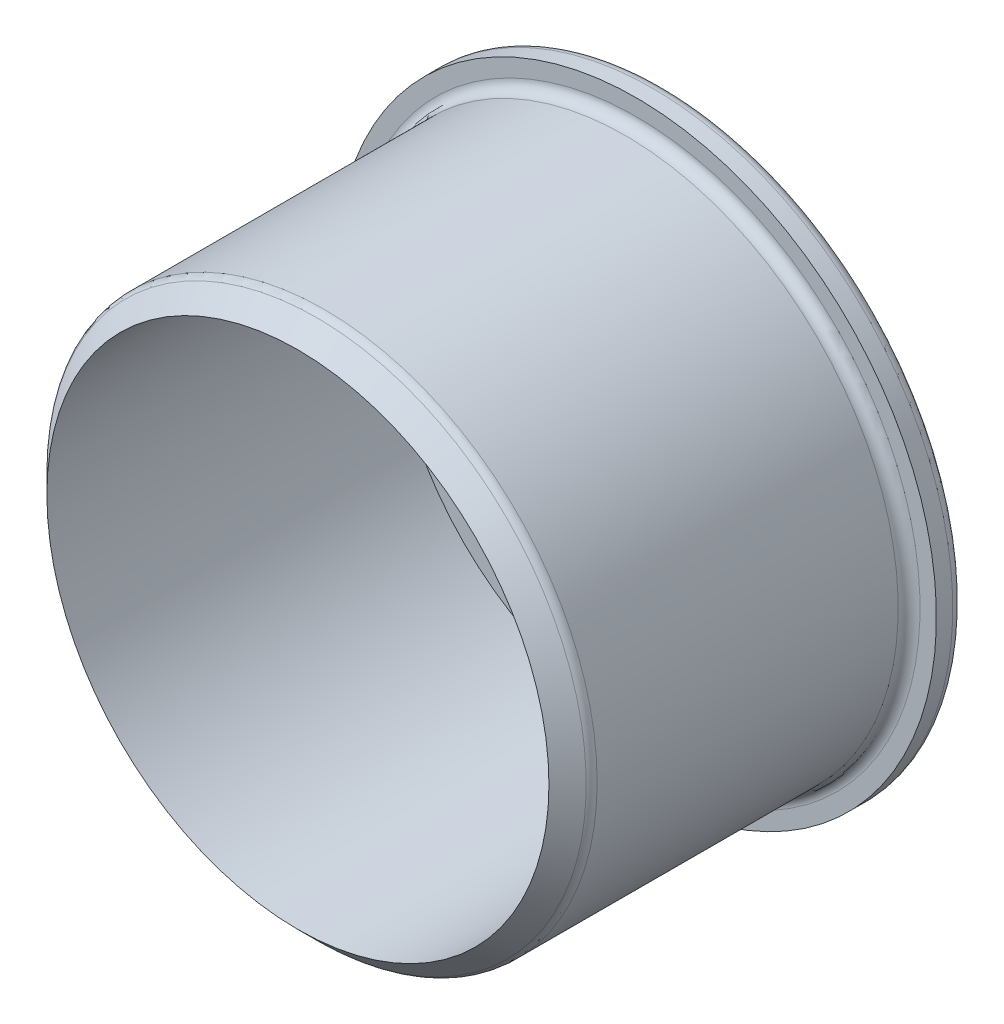
ISO-10303-21;
HEADER;
FILE_DESCRIPTION(('STEP AP214'),'2;1');
FILE_NAME('part.step','',(''),(''),'','','');
FILE_SCHEMA(('AUTOMOTIVE_DESIGN { 1 0 10303 214 1 1 1 1 }'));
ENDSEC;
DATA;
#1=APPLICATION_CONTEXT('core data for automotive mechanical design processes');
#2=APPLICATION_PROTOCOL_DEFINITION('international standard','automotive_design',2000,#1);
#3=PRODUCT_CONTEXT('',#1,'mechanical');
#4=PRODUCT('Part','Part','',(#3));
#5=PRODUCT_RELATED_PRODUCT_CATEGORY('part','',(#4));
#6=PRODUCT_DEFINITION_FORMATION('','',#4);
#7=PRODUCT_DEFINITION_CONTEXT('part definition',#1,'design');
#8=PRODUCT_DEFINITION('design','',#6,#7);
#9=PRODUCT_DEFINITION_SHAPE('','',#8);
#10=(LENGTH_UNIT() NAMED_UNIT(*) SI_UNIT(.MILLI.,.METRE.));
#11=(NAMED_UNIT(*) PLANE_ANGLE_UNIT() SI_UNIT($,.RADIAN.));
#12=(NAMED_UNIT(*) SI_UNIT($,.STERADIAN.) SOLID_ANGLE_UNIT());
#13=UNCERTAINTY_MEASURE_WITH_UNIT(LENGTH_MEASURE(1.E-05),#10,'distance_accuracy_value','');
#14=(GEOMETRIC_REPRESENTATION_CONTEXT(3) GLOBAL_UNCERTAINTY_ASSIGNED_CONTEXT((#13)) GLOBAL_UNIT_ASSIGNED_CONTEXT((#10,
#11,#12)) REPRESENTATION_CONTEXT('',''));
#15=CARTESIAN_POINT('',(0.,0.,0.));
#16=DIRECTION('',(0.,0.,1.));
#17=DIRECTION('',(1.,0.,0.));
#18=AXIS2_PLACEMENT_3D('',#15,#16,#17);
#19=CARTESIAN_POINT('',(0.,0.,32.));
#20=DIRECTION('',(0.,0.,-1.));
#21=DIRECTION('',(-1.,0.,0.));
#22=AXIS2_PLACEMENT_3D('',#19,#20,#21);
#23=CYLINDRICAL_SURFACE('',#22,25.);
#24=CARTESIAN_POINT('',(0.,0.,1.));
#25=DIRECTION('',(0.,0.,-1.));
#26=DIRECTION('',(-1.,0.,0.));
#27=AXIS2_PLACEMENT_3D('',#24,#25,#26);
#28=CIRCLE('',#27,25.);
#29=CARTESIAN_POINT('',(-25.,0.,1.));
#30=VERTEX_POINT('',#29);
#31=EDGE_CURVE('E59',#30,#30,#28,.F.);
#32=ORIENTED_EDGE('',*,*,#31,.T.);
#33=EDGE_LOOP('',(#32));
#34=FACE_BOUND('',#33,.T.);
#35=CARTESIAN_POINT('',(0.,0.,28.5857864376269));
#36=DIRECTION('',(0.,0.,1.));
#37=DIRECTION('',(1.,0.,0.));
#38=AXIS2_PLACEMENT_3D('',#35,#36,#37);
#39=CIRCLE('',#38,25.);
#40=CARTESIAN_POINT('',(25.,0.,28.5857864376269));
#41=VERTEX_POINT('',#40);
#42=EDGE_CURVE('E65',#41,#41,#39,.F.);
#43=ORIENTED_EDGE('',*,*,#42,.T.);
#44=EDGE_LOOP('',(#43));
#45=FACE_BOUND('',#44,.T.);
#46=ADVANCED_FACE('F42',(#34,#45),#23,.T.);
#47=CARTESIAN_POINT('',(0.,0.,-2.5));
#48=DIRECTION('',(0.,0.,1.));
#49=DIRECTION('',(1.,0.,0.));
#50=AXIS2_PLACEMENT_3D('',#47,#48,#49);
#51=CYLINDRICAL_SURFACE('',#50,27.5);
#52=CARTESIAN_POINT('',(0.,0.,-1.5));
#53=DIRECTION('',(0.,0.,-1.));
#54=DIRECTION('',(-1.,0.,0.));
#55=AXIS2_PLACEMENT_3D('',#52,#53,#54);
#56=CIRCLE('',#55,27.5);
#57=CARTESIAN_POINT('',(-27.5,0.,-1.5));
#58=VERTEX_POINT('',#57);
#59=EDGE_CURVE('E10',#58,#58,#56,.F.);
#60=ORIENTED_EDGE('',*,*,#59,.T.);
#61=EDGE_LOOP('',(#60));
#62=FACE_BOUND('',#61,.T.);
#63=CARTESIAN_POINT('',(0.,0.,0.));
#64=DIRECTION('',(0.,0.,-1.));
#65=DIRECTION('',(-1.,0.,0.));
#66=AXIS2_PLACEMENT_3D('',#63,#64,#65);
#67=CIRCLE('',#66,27.5);
#68=CARTESIAN_POINT('',(-27.5,0.,0.));
#69=VERTEX_POINT('',#68);
#70=EDGE_CURVE('E71',#69,#69,#67,.T.);
#71=ORIENTED_EDGE('',*,*,#70,.T.);
#72=EDGE_LOOP('',(#71));
#73=FACE_BOUND('',#72,.T.);
#74=ADVANCED_FACE('F106',(#62,#73),#51,.T.);
#75=CARTESIAN_POINT('',(0.,0.,-2.5));
#76=DIRECTION('',(0.,0.,-1.));
#77=DIRECTION('',(-1.,0.,0.));
#78=AXIS2_PLACEMENT_3D('',#75,#76,#77);
#79=PLANE('',#78);
#80=CARTESIAN_POINT('',(0.,0.,-2.5));
#81=DIRECTION('',(0.,0.,-1.));
#82=DIRECTION('',(-1.,0.,0.));
#83=AXIS2_PLACEMENT_3D('',#80,#81,#82);
#84=CIRCLE('',#83,1.6);
#85=CARTESIAN_POINT('',(-1.6,0.,-2.5));
#86=VERTEX_POINT('',#85);
#87=EDGE_CURVE('E77',#86,#86,#84,.T.);
#88=ORIENTED_EDGE('',*,*,#87,.F.);
#89=EDGE_LOOP('',(#88));
#90=FACE_BOUND('',#89,.T.);
#91=CARTESIAN_POINT('',(0.,0.,-2.5));
#92=DIRECTION('',(0.,0.,-1.));
#93=DIRECTION('',(-1.,0.,0.));
#94=AXIS2_PLACEMENT_3D('',#91,#92,#93);
#95=CIRCLE('',#94,26.5);
#96=CARTESIAN_POINT('',(-26.5,0.,-2.5));
#97=VERTEX_POINT('',#96);
#98=EDGE_CURVE('E50',#97,#97,#95,.T.);
#99=ORIENTED_EDGE('',*,*,#98,.T.);
#100=EDGE_LOOP('',(#99));
#101=FACE_BOUND('',#100,.T.);
#102=ADVANCED_FACE('F101',(#90,#101),#79,.T.);
#103=CARTESIAN_POINT('',(0.,0.,0.));
#104=DIRECTION('',(0.,0.,-1.));
#105=DIRECTION('',(-1.,0.,0.));
#106=AXIS2_PLACEMENT_3D('',#103,#104,#105);
#107=PLANE('',#106);
#108=CARTESIAN_POINT('',(0.,0.,0.));
#109=DIRECTION('',(0.,0.,-1.));
#110=DIRECTION('',(-1.,0.,0.));
#111=AXIS2_PLACEMENT_3D('',#108,#109,#110);
#112=CIRCLE('',#111,26.);
#113=CARTESIAN_POINT('',(-26.,0.,0.));
#114=VERTEX_POINT('',#113);
#115=EDGE_CURVE('E54',#114,#114,#112,.T.);
#116=ORIENTED_EDGE('',*,*,#115,.T.);
#117=EDGE_LOOP('',(#116));
#118=FACE_BOUND('',#117,.T.);
#119=ORIENTED_EDGE('',*,*,#70,.F.);
#120=EDGE_LOOP('',(#119));
#121=FACE_BOUND('',#120,.T.);
#122=ADVANCED_FACE('F95',(#118,#121),#107,.F.);
#123=CARTESIAN_POINT('',(0.,0.,-0.500000000000021));
#124=DIRECTION('',(0.,0.,1.));
#125=DIRECTION('',(1.,0.,0.));
#126=AXIS2_PLACEMENT_3D('',#123,#124,#125);
#127=CYLINDRICAL_SURFACE('',#126,23.);
#128=CARTESIAN_POINT('',(0.,0.,31.));
#129=DIRECTION('',(0.,0.,-1.));
#130=DIRECTION('',(-1.,0.,0.));
#131=AXIS2_PLACEMENT_3D('',#128,#129,#130);
#132=CIRCLE('',#131,23.);
#133=CARTESIAN_POINT('',(-23.,0.,31.));
#134=VERTEX_POINT('',#133);
#135=EDGE_CURVE('E68',#134,#134,#132,.F.);
#136=ORIENTED_EDGE('',*,*,#135,.T.);
#137=EDGE_LOOP('',(#136));
#138=FACE_BOUND('',#137,.T.);
#139=CARTESIAN_POINT('',(0.,0.,-0.500000000000021));
#140=DIRECTION('',(0.,0.,1.));
#141=DIRECTION('',(1.,0.,0.));
#142=AXIS2_PLACEMENT_3D('',#139,#140,#141);
#143=CIRCLE('',#142,23.);
#144=CARTESIAN_POINT('',(23.,0.,-0.500000000000021));
#145=VERTEX_POINT('',#144);
#146=EDGE_CURVE('E74',#145,#145,#143,.T.);
#147=ORIENTED_EDGE('',*,*,#146,.F.);
#148=EDGE_LOOP('',(#147));
#149=FACE_BOUND('',#148,.T.);
#150=ADVANCED_FACE('F90',(#138,#149),#127,.F.);
#151=CARTESIAN_POINT('',(0.,0.,-0.500000000000021));
#152=DIRECTION('',(0.,0.,1.));
#153=DIRECTION('',(1.,0.,0.));
#154=AXIS2_PLACEMENT_3D('',#151,#152,#153);
#155=PLANE('',#154);
#156=CARTESIAN_POINT('',(0.,0.,-0.500000000000021));
#157=DIRECTION('',(0.,0.,1.));
#158=DIRECTION('',(1.,0.,0.));
#159=AXIS2_PLACEMENT_3D('',#156,#157,#158);
#160=CIRCLE('',#159,1.6);
#161=CARTESIAN_POINT('',(1.6,0.,-0.500000000000021));
#162=VERTEX_POINT('',#161);
#163=EDGE_CURVE('E46',#162,#162,#160,.T.);
#164=ORIENTED_EDGE('',*,*,#163,.F.);
#165=EDGE_LOOP('',(#164));
#166=FACE_BOUND('',#165,.T.);
#167=ORIENTED_EDGE('',*,*,#146,.T.);
#168=EDGE_LOOP('',(#167));
#169=FACE_BOUND('',#168,.T.);
#170=ADVANCED_FACE('F86',(#166,#169),#155,.T.);
#171=CARTESIAN_POINT('',(0.,0.,32.));
#172=DIRECTION('',(0.,0.,-1.));
#173=DIRECTION('',(-1.,0.,0.));
#174=AXIS2_PLACEMENT_3D('',#171,#172,#173);
#175=CONICAL_SURFACE('',#174,22.,0.785398163397453);
#176=CARTESIAN_POINT('',(0.,0.,29.2928932188134));
#177=DIRECTION('',(0.,0.,-1.));
#178=DIRECTION('',(-1.,0.,0.));
#179=AXIS2_PLACEMENT_3D('',#176,#177,#178);
#180=CIRCLE('',#179,24.7071067811866);
#181=CARTESIAN_POINT('',(-24.7071067811866,0.,29.2928932188134));
#182=VERTEX_POINT('',#181);
#183=EDGE_CURVE('E62',#182,#182,#180,.F.);
#184=ORIENTED_EDGE('',*,*,#183,.T.);
#185=EDGE_LOOP('',(#184));
#186=FACE_BOUND('',#185,.T.);
#187=ORIENTED_EDGE('',*,*,#135,.F.);
#188=EDGE_LOOP('',(#187));
#189=FACE_BOUND('',#188,.T.);
#190=ADVANCED_FACE('F89',(#186,#189),#175,.T.);
#191=CARTESIAN_POINT('',(0.,0.,28.5857864376269));
#192=DIRECTION('',(0.,0.,1.));
#193=DIRECTION('',(1.,0.,0.));
#194=AXIS2_PLACEMENT_3D('',#191,#192,#193);
#195=TOROIDAL_SURFACE('',#194,24.,1.);
#196=ORIENTED_EDGE('',*,*,#183,.F.);
#197=EDGE_LOOP('',(#196));
#198=FACE_BOUND('',#197,.T.);
#199=ORIENTED_EDGE('',*,*,#42,.F.);
#200=EDGE_LOOP('',(#199));
#201=FACE_BOUND('',#200,.T.);
#202=ADVANCED_FACE('F120',(#198,#201),#195,.T.);
#203=CARTESIAN_POINT('',(0.,0.,1.));
#204=DIRECTION('',(0.,0.,-1.));
#205=DIRECTION('',(-1.,0.,0.));
#206=AXIS2_PLACEMENT_3D('',#203,#204,#205);
#207=TOROIDAL_SURFACE('',#206,26.,1.);
#208=ORIENTED_EDGE('',*,*,#115,.F.);
#209=EDGE_LOOP('',(#208));
#210=FACE_BOUND('',#209,.T.);
#211=ORIENTED_EDGE('',*,*,#31,.F.);
#212=EDGE_LOOP('',(#211));
#213=FACE_BOUND('',#212,.T.);
#214=ADVANCED_FACE('F123',(#210,#213),#207,.F.);
#215=CARTESIAN_POINT('',(0.,0.,-1.5));
#216=DIRECTION('',(0.,0.,-1.));
#217=DIRECTION('',(-1.,0.,0.));
#218=AXIS2_PLACEMENT_3D('',#215,#216,#217);
#219=TOROIDAL_SURFACE('',#218,26.5,1.);
#220=ORIENTED_EDGE('',*,*,#59,.F.);
#221=EDGE_LOOP('',(#220));
#222=FACE_BOUND('',#221,.T.);
#223=ORIENTED_EDGE('',*,*,#98,.F.);
#224=EDGE_LOOP('',(#223));
#225=FACE_BOUND('',#224,.T.);
#226=ADVANCED_FACE('F44',(#222,#225),#219,.T.);
#227=CARTESIAN_POINT('',(0.,0.,30.));
#228=DIRECTION('',(0.,0.,-1.));
#229=DIRECTION('',(-1.,0.,0.));
#230=AXIS2_PLACEMENT_3D('',#227,#228,#229);
#231=CYLINDRICAL_SURFACE('',#230,1.6);
#232=ORIENTED_EDGE('',*,*,#163,.T.);
#233=EDGE_LOOP('',(#232));
#234=FACE_BOUND('',#233,.T.);
#235=ORIENTED_EDGE('',*,*,#87,.T.);
#236=EDGE_LOOP('',(#235));
#237=FACE_BOUND('',#236,.T.);
#238=ADVANCED_FACE('F84',(#234,#237),#231,.F.);
#239=CLOSED_SHELL('',(#46,#74,#102,#122,#150,#170,#190,#202,#214,#226,#238));
#240=MANIFOLD_SOLID_BREP('B2',#239);
#241=ADVANCED_BREP_SHAPE_REPRESENTATION('',(#18,#240),#14);
#242=SHAPE_DEFINITION_REPRESENTATION(#9,#241);
ENDSEC;
END-ISO-10303-21;
